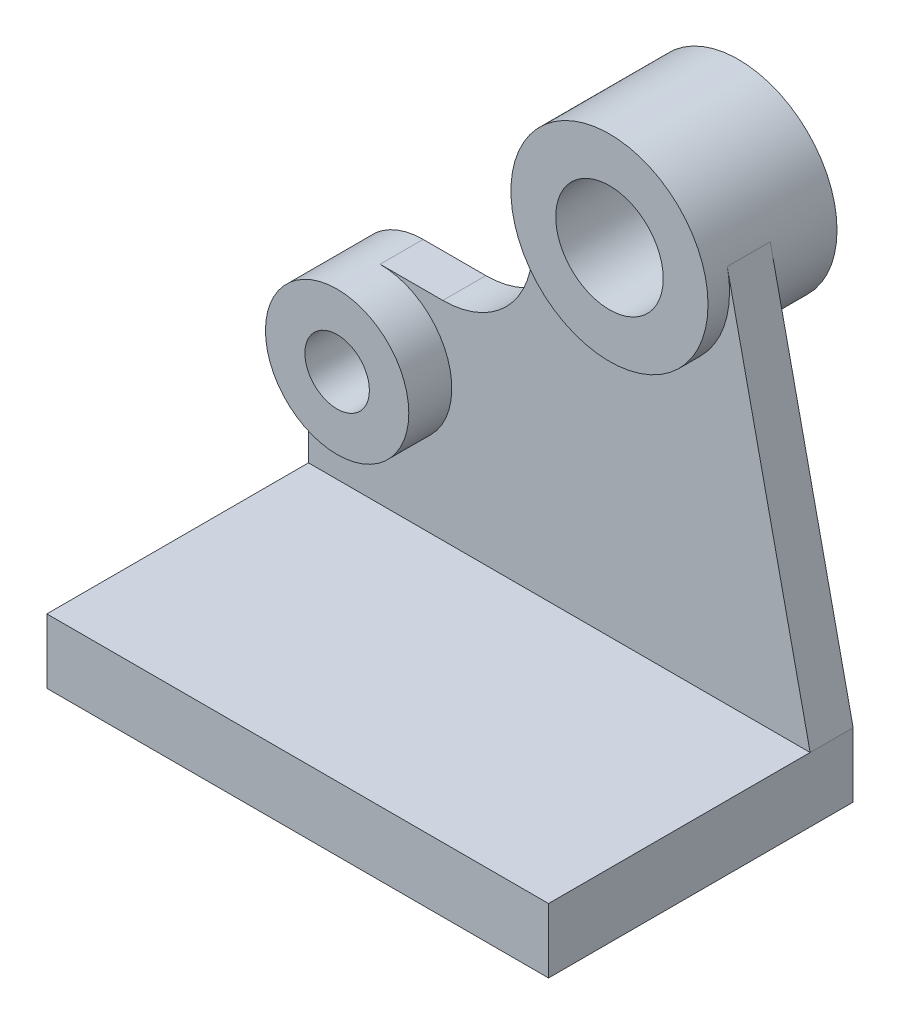
ISO-10303-21;
HEADER;
FILE_DESCRIPTION(('STEP AP214'),'2;1');
FILE_NAME('part.step','',(''),(''),'','','');
FILE_SCHEMA(('AUTOMOTIVE_DESIGN { 1 0 10303 214 1 1 1 1 }'));
ENDSEC;
DATA;
#1=APPLICATION_CONTEXT('core data for automotive mechanical design processes');
#2=APPLICATION_PROTOCOL_DEFINITION('international standard','automotive_design',2000,#1);
#3=PRODUCT_CONTEXT('',#1,'mechanical');
#4=PRODUCT('Part','Part','',(#3));
#5=PRODUCT_RELATED_PRODUCT_CATEGORY('part','',(#4));
#6=PRODUCT_DEFINITION_FORMATION('','',#4);
#7=PRODUCT_DEFINITION_CONTEXT('part definition',#1,'design');
#8=PRODUCT_DEFINITION('design','',#6,#7);
#9=PRODUCT_DEFINITION_SHAPE('','',#8);
#10=(LENGTH_UNIT() NAMED_UNIT(*) SI_UNIT(.MILLI.,.METRE.));
#11=(NAMED_UNIT(*) PLANE_ANGLE_UNIT() SI_UNIT($,.RADIAN.));
#12=(NAMED_UNIT(*) SI_UNIT($,.STERADIAN.) SOLID_ANGLE_UNIT());
#13=UNCERTAINTY_MEASURE_WITH_UNIT(LENGTH_MEASURE(1.E-05),#10,'distance_accuracy_value','');
#14=(GEOMETRIC_REPRESENTATION_CONTEXT(3) GLOBAL_UNCERTAINTY_ASSIGNED_CONTEXT((#13)) GLOBAL_UNIT_ASSIGNED_CONTEXT((#10,
#11,#12)) REPRESENTATION_CONTEXT('',''));
#15=CARTESIAN_POINT('',(0.,0.,0.));
#16=DIRECTION('',(0.,0.,1.));
#17=DIRECTION('',(1.,0.,0.));
#18=AXIS2_PLACEMENT_3D('',#15,#16,#17);
#19=CARTESIAN_POINT('',(-90.,0.,12.));
#20=DIRECTION('',(-1.,0.,0.));
#21=DIRECTION('',(0.,0.,1.));
#22=AXIS2_PLACEMENT_3D('',#19,#20,#21);
#23=PLANE('',#22);
#24=DIRECTION('',(0.,1.,0.));
#25=VECTOR('',#24,1.);
#26=CARTESIAN_POINT('',(-90.,0.,0.));
#27=LINE('',#26,#25);
#28=CARTESIAN_POINT('',(-90.,-118.,0.));
#29=VERTEX_POINT('',#28);
#30=CARTESIAN_POINT('',(-90.,-62.,0.));
#31=VERTEX_POINT('',#30);
#32=EDGE_CURVE('E199',#29,#31,#27,.T.);
#33=ORIENTED_EDGE('',*,*,#32,.F.);
#34=DIRECTION('',(0.,0.,-1.));
#35=VECTOR('',#34,1.);
#36=CARTESIAN_POINT('',(-90.,-118.,85.));
#37=LINE('',#36,#35);
#38=CARTESIAN_POINT('',(-90.,-118.,85.));
#39=VERTEX_POINT('',#38);
#40=EDGE_CURVE('E137',#39,#29,#37,.T.);
#41=ORIENTED_EDGE('',*,*,#40,.F.);
#42=DIRECTION('',(0.,1.,0.));
#43=VECTOR('',#42,1.);
#44=CARTESIAN_POINT('',(-90.,0.,85.));
#45=LINE('',#44,#43);
#46=CARTESIAN_POINT('',(-90.,-100.,85.));
#47=VERTEX_POINT('',#46);
#48=EDGE_CURVE('E143',#39,#47,#45,.T.);
#49=ORIENTED_EDGE('',*,*,#48,.T.);
#50=DIRECTION('',(0.,0.,-1.));
#51=VECTOR('',#50,1.);
#52=CARTESIAN_POINT('',(-90.,-100.,85.));
#53=LINE('',#52,#51);
#54=CARTESIAN_POINT('',(-90.,-100.,12.));
#55=VERTEX_POINT('',#54);
#56=EDGE_CURVE('E124',#47,#55,#53,.T.);
#57=ORIENTED_EDGE('',*,*,#56,.T.);
#58=DIRECTION('',(0.,1.,0.));
#59=VECTOR('',#58,1.);
#60=CARTESIAN_POINT('',(-90.,0.,12.));
#61=LINE('',#60,#59);
#62=CARTESIAN_POINT('',(-90.,-62.,12.));
#63=VERTEX_POINT('',#62);
#64=EDGE_CURVE('E208',#55,#63,#61,.T.);
#65=ORIENTED_EDGE('',*,*,#64,.T.);
#66=DIRECTION('',(0.,0.,-1.));
#67=VECTOR('',#66,1.);
#68=CARTESIAN_POINT('',(-90.,-62.,12.));
#69=LINE('',#68,#67);
#70=EDGE_CURVE('E259',#63,#31,#69,.T.);
#71=ORIENTED_EDGE('',*,*,#70,.T.);
#72=EDGE_LOOP('',(#33,#41,#49,#57,#65,#71));
#73=FACE_BOUND('',#72,.T.);
#74=ADVANCED_FACE('F45',(#73),#23,.T.);
#75=CARTESIAN_POINT('',(26.8660884818626,5.87054424093129,12.));
#76=DIRECTION('',(-0.97694867206773,-0.213474336033865,0.));
#77=DIRECTION('',(0.213474336033865,-0.97694867206773,0.));
#78=AXIS2_PLACEMENT_3D('',#75,#76,#77);
#79=PLANE('',#78);
#80=DIRECTION('',(-0.213474336033865,0.97694867206773,0.));
#81=VECTOR('',#80,1.);
#82=CARTESIAN_POINT('',(26.8660884818626,5.87054424093129,0.));
#83=LINE('',#82,#81);
#84=CARTESIAN_POINT('',(50.,-100.,0.));
#85=VERTEX_POINT('',#84);
#86=CARTESIAN_POINT('',(26.8660884818626,5.87054424093129,0.));
#87=VERTEX_POINT('',#86);
#88=EDGE_CURVE('E232',#85,#87,#83,.T.);
#89=ORIENTED_EDGE('',*,*,#88,.T.);
#90=DIRECTION('',(0.,0.,-1.));
#91=VECTOR('',#90,1.);
#92=CARTESIAN_POINT('',(26.8660884818626,5.87054424093129,12.));
#93=LINE('',#92,#91);
#94=CARTESIAN_POINT('',(26.8660884818626,5.87054424093129,12.));
#95=VERTEX_POINT('',#94);
#96=EDGE_CURVE('E252',#95,#87,#93,.T.);
#97=ORIENTED_EDGE('',*,*,#96,.F.);
#98=DIRECTION('',(-0.213474336033865,0.97694867206773,0.));
#99=VECTOR('',#98,1.);
#100=CARTESIAN_POINT('',(26.8660884818626,5.87054424093129,12.));
#101=LINE('',#100,#99);
#102=CARTESIAN_POINT('',(50.,-100.,12.));
#103=VERTEX_POINT('',#102);
#104=EDGE_CURVE('E214',#103,#95,#101,.T.);
#105=ORIENTED_EDGE('',*,*,#104,.F.);
#106=DIRECTION('',(0.,0.,-1.));
#107=VECTOR('',#106,1.);
#108=CARTESIAN_POINT('',(50.,-100.,12.));
#109=LINE('',#108,#107);
#110=EDGE_CURVE('E255',#103,#85,#109,.T.);
#111=ORIENTED_EDGE('',*,*,#110,.T.);
#112=EDGE_LOOP('',(#89,#97,#105,#111));
#113=FACE_BOUND('',#112,.T.);
#114=ADVANCED_FACE('F292',(#113),#79,.F.);
#115=CARTESIAN_POINT('',(-27.5,0.,12.));
#116=DIRECTION('',(-1.,0.,0.));
#117=DIRECTION('',(0.,-1.,0.));
#118=AXIS2_PLACEMENT_3D('',#115,#116,#117);
#119=PLANE('',#118);
#120=DIRECTION('',(0.,1.,0.));
#121=VECTOR('',#120,1.);
#122=CARTESIAN_POINT('',(-27.5,0.,0.));
#123=LINE('',#122,#121);
#124=CARTESIAN_POINT('',(-27.5,-17.,0.));
#125=VERTEX_POINT('',#124);
#126=CARTESIAN_POINT('',(-27.5,0.,0.));
#127=VERTEX_POINT('',#126);
#128=EDGE_CURVE('E240',#125,#127,#123,.T.);
#129=ORIENTED_EDGE('',*,*,#128,.F.);
#130=DIRECTION('',(0.,0.,-1.));
#131=VECTOR('',#130,1.);
#132=CARTESIAN_POINT('',(-27.5,-17.,12.));
#133=LINE('',#132,#131);
#134=CARTESIAN_POINT('',(-27.5,-17.,12.));
#135=VERTEX_POINT('',#134);
#136=EDGE_CURVE('E61',#125,#135,#133,.F.);
#137=ORIENTED_EDGE('',*,*,#136,.T.);
#138=DIRECTION('',(0.,1.,0.));
#139=VECTOR('',#138,1.);
#140=CARTESIAN_POINT('',(-27.5,0.,12.));
#141=LINE('',#140,#139);
#142=CARTESIAN_POINT('',(-27.5,0.,12.));
#143=VERTEX_POINT('',#142);
#144=EDGE_CURVE('E221',#135,#143,#141,.T.);
#145=ORIENTED_EDGE('',*,*,#144,.T.);
#146=DIRECTION('',(0.,0.,-1.));
#147=VECTOR('',#146,1.);
#148=CARTESIAN_POINT('',(-27.5,0.,12.));
#149=LINE('',#148,#147);
#150=EDGE_CURVE('E248',#143,#127,#149,.T.);
#151=ORIENTED_EDGE('',*,*,#150,.T.);
#152=EDGE_LOOP('',(#129,#137,#145,#151));
#153=FACE_BOUND('',#152,.T.);
#154=ADVANCED_FACE('F296',(#153),#119,.T.);
#155=CARTESIAN_POINT('',(0.,-42.,12.));
#156=DIRECTION('',(0.,1.,0.));
#157=DIRECTION('',(-1.,0.,0.));
#158=AXIS2_PLACEMENT_3D('',#155,#156,#157);
#159=PLANE('',#158);
#160=DIRECTION('',(1.,0.,0.));
#161=VECTOR('',#160,1.);
#162=CARTESIAN_POINT('',(0.,-42.,12.));
#163=LINE('',#162,#161);
#164=CARTESIAN_POINT('',(-70.,-42.,12.));
#165=VERTEX_POINT('',#164);
#166=CARTESIAN_POINT('',(-52.5,-42.,12.));
#167=VERTEX_POINT('',#166);
#168=EDGE_CURVE('E224',#165,#167,#163,.T.);
#169=ORIENTED_EDGE('',*,*,#168,.T.);
#170=DIRECTION('',(0.,0.,-1.));
#171=VECTOR('',#170,1.);
#172=CARTESIAN_POINT('',(-52.5,-42.,0.));
#173=LINE('',#172,#171);
#174=CARTESIAN_POINT('',(-52.5,-42.,0.));
#175=VERTEX_POINT('',#174);
#176=EDGE_CURVE('E263',#167,#175,#173,.T.);
#177=ORIENTED_EDGE('',*,*,#176,.T.);
#178=DIRECTION('',(1.,0.,0.));
#179=VECTOR('',#178,1.);
#180=CARTESIAN_POINT('',(0.,-42.,0.));
#181=LINE('',#180,#179);
#182=CARTESIAN_POINT('',(-70.,-42.,0.));
#183=VERTEX_POINT('',#182);
#184=EDGE_CURVE('E209',#183,#175,#181,.T.);
#185=ORIENTED_EDGE('',*,*,#184,.F.);
#186=DIRECTION('',(0.,0.,-1.));
#187=VECTOR('',#186,1.);
#188=CARTESIAN_POINT('',(-70.,-42.,12.));
#189=LINE('',#188,#187);
#190=EDGE_CURVE('E228',#165,#183,#189,.T.);
#191=ORIENTED_EDGE('',*,*,#190,.F.);
#192=EDGE_LOOP('',(#169,#177,#185,#191));
#193=FACE_BOUND('',#192,.T.);
#194=ADVANCED_FACE('F272',(#193),#159,.T.);
#195=CARTESIAN_POINT('',(0.,0.,12.));
#196=DIRECTION('',(0.,0.,1.));
#197=DIRECTION('',(1.,0.,0.));
#198=AXIS2_PLACEMENT_3D('',#195,#196,#197);
#199=PLANE('',#198);
#200=CARTESIAN_POINT('',(-70.,-62.,12.));
#201=DIRECTION('',(0.,0.,1.));
#202=DIRECTION('',(1.,0.,0.));
#203=AXIS2_PLACEMENT_3D('',#200,#201,#202);
#204=CIRCLE('',#203,20.);
#205=EDGE_CURVE('E205',#63,#165,#204,.T.);
#206=ORIENTED_EDGE('',*,*,#205,.F.);
#207=ORIENTED_EDGE('',*,*,#64,.F.);
#208=DIRECTION('',(1.,0.,0.));
#209=VECTOR('',#208,1.);
#210=CARTESIAN_POINT('',(0.,-100.,12.));
#211=LINE('',#210,#209);
#212=EDGE_CURVE('E130',#55,#103,#211,.T.);
#213=ORIENTED_EDGE('',*,*,#212,.T.);
#214=ORIENTED_EDGE('',*,*,#104,.T.);
#215=CARTESIAN_POINT('',(0.,0.,12.));
#216=DIRECTION('',(0.,0.,1.));
#217=DIRECTION('',(1.,0.,0.));
#218=AXIS2_PLACEMENT_3D('',#215,#216,#217);
#219=CIRCLE('',#218,27.5);
#220=EDGE_CURVE('E218',#143,#95,#219,.T.);
#221=ORIENTED_EDGE('',*,*,#220,.F.);
#222=ORIENTED_EDGE('',*,*,#144,.F.);
#223=CARTESIAN_POINT('',(-52.5,-17.,12.));
#224=DIRECTION('',(0.,0.,1.));
#225=DIRECTION('',(1.,0.,0.));
#226=AXIS2_PLACEMENT_3D('',#223,#224,#225);
#227=CIRCLE('',#226,25.);
#228=EDGE_CURVE('E11',#135,#167,#227,.F.);
#229=ORIENTED_EDGE('',*,*,#228,.T.);
#230=ORIENTED_EDGE('',*,*,#168,.F.);
#231=EDGE_LOOP('',(#206,#207,#213,#214,#221,#222,#229,#230));
#232=FACE_BOUND('',#231,.T.);
#233=ADVANCED_FACE('F283',(#232),#199,.T.);
#234=CARTESIAN_POINT('',(0.,0.,0.));
#235=DIRECTION('',(0.,0.,1.));
#236=DIRECTION('',(1.,0.,0.));
#237=AXIS2_PLACEMENT_3D('',#234,#235,#236);
#238=PLANE('',#237);
#239=ORIENTED_EDGE('',*,*,#32,.T.);
#240=CARTESIAN_POINT('',(-70.,-62.,0.));
#241=DIRECTION('',(0.,0.,1.));
#242=DIRECTION('',(1.,0.,0.));
#243=AXIS2_PLACEMENT_3D('',#240,#241,#242);
#244=CIRCLE('',#243,20.);
#245=EDGE_CURVE('E195',#183,#31,#244,.T.);
#246=ORIENTED_EDGE('',*,*,#245,.F.);
#247=ORIENTED_EDGE('',*,*,#184,.T.);
#248=CARTESIAN_POINT('',(-52.5,-17.,0.));
#249=DIRECTION('',(0.,0.,1.));
#250=DIRECTION('',(1.,0.,0.));
#251=AXIS2_PLACEMENT_3D('',#248,#249,#250);
#252=CIRCLE('',#251,25.);
#253=EDGE_CURVE('E54',#175,#125,#252,.T.);
#254=ORIENTED_EDGE('',*,*,#253,.T.);
#255=ORIENTED_EDGE('',*,*,#128,.T.);
#256=CARTESIAN_POINT('',(0.,0.,0.));
#257=DIRECTION('',(0.,0.,1.));
#258=DIRECTION('',(1.,0.,0.));
#259=AXIS2_PLACEMENT_3D('',#256,#257,#258);
#260=CIRCLE('',#259,27.5);
#261=EDGE_CURVE('E236',#127,#87,#260,.T.);
#262=ORIENTED_EDGE('',*,*,#261,.T.);
#263=ORIENTED_EDGE('',*,*,#88,.F.);
#264=DIRECTION('',(0.,-1.,0.));
#265=VECTOR('',#264,1.);
#266=CARTESIAN_POINT('',(50.,0.,0.));
#267=LINE('',#266,#265);
#268=CARTESIAN_POINT('',(50.,-118.,0.));
#269=VERTEX_POINT('',#268);
#270=EDGE_CURVE('E148',#85,#269,#267,.T.);
#271=ORIENTED_EDGE('',*,*,#270,.T.);
#272=DIRECTION('',(-1.,0.,0.));
#273=VECTOR('',#272,1.);
#274=CARTESIAN_POINT('',(0.,-118.,0.));
#275=LINE('',#274,#273);
#276=EDGE_CURVE('E160',#269,#29,#275,.T.);
#277=ORIENTED_EDGE('',*,*,#276,.T.);
#278=EDGE_LOOP('',(#239,#246,#247,#254,#255,#262,#263,#271,#277));
#279=FACE_BOUND('',#278,.T.);
#280=CARTESIAN_POINT('',(-70.,-62.,0.));
#281=DIRECTION('',(0.,0.,1.));
#282=DIRECTION('',(1.,0.,0.));
#283=AXIS2_PLACEMENT_3D('',#280,#281,#282);
#284=CIRCLE('',#283,9.);
#285=CARTESIAN_POINT('',(-61.,-62.,0.));
#286=VERTEX_POINT('',#285);
#287=EDGE_CURVE('E183',#286,#286,#284,.T.);
#288=ORIENTED_EDGE('',*,*,#287,.T.);
#289=EDGE_LOOP('',(#288));
#290=FACE_BOUND('',#289,.T.);
#291=ADVANCED_FACE('F277',(#279,#290),#238,.F.);
#292=CARTESIAN_POINT('',(-70.,-62.,24.));
#293=DIRECTION('',(0.,0.,-1.));
#294=DIRECTION('',(-1.,0.,0.));
#295=AXIS2_PLACEMENT_3D('',#292,#293,#294);
#296=CYLINDRICAL_SURFACE('',#295,20.);
#297=CARTESIAN_POINT('',(-70.,-62.,24.));
#298=DIRECTION('',(0.,0.,1.));
#299=DIRECTION('',(1.,0.,0.));
#300=AXIS2_PLACEMENT_3D('',#297,#298,#299);
#301=CIRCLE('',#300,20.);
#302=CARTESIAN_POINT('',(-50.,-62.,24.));
#303=VERTEX_POINT('',#302);
#304=EDGE_CURVE('E194',#303,#303,#301,.T.);
#305=ORIENTED_EDGE('',*,*,#304,.F.);
#306=EDGE_LOOP('',(#305));
#307=FACE_BOUND('',#306,.T.);
#308=ORIENTED_EDGE('',*,*,#245,.T.);
#309=ORIENTED_EDGE('',*,*,#70,.F.);
#310=ORIENTED_EDGE('',*,*,#205,.T.);
#311=ORIENTED_EDGE('',*,*,#190,.T.);
#312=EDGE_LOOP('',(#308,#309,#310,#311));
#313=FACE_BOUND('',#312,.T.);
#314=ADVANCED_FACE('F280',(#307,#313),#296,.T.);
#315=CARTESIAN_POINT('',(-70.,-62.,24.));
#316=DIRECTION('',(0.,0.,-1.));
#317=DIRECTION('',(-1.,0.,0.));
#318=AXIS2_PLACEMENT_3D('',#315,#316,#317);
#319=CYLINDRICAL_SURFACE('',#318,9.);
#320=CARTESIAN_POINT('',(-70.,-62.,24.));
#321=DIRECTION('',(0.,0.,1.));
#322=DIRECTION('',(1.,0.,0.));
#323=AXIS2_PLACEMENT_3D('',#320,#321,#322);
#324=CIRCLE('',#323,9.);
#325=CARTESIAN_POINT('',(-61.,-62.,24.));
#326=VERTEX_POINT('',#325);
#327=EDGE_CURVE('E190',#326,#326,#324,.T.);
#328=ORIENTED_EDGE('',*,*,#327,.T.);
#329=EDGE_LOOP('',(#328));
#330=FACE_BOUND('',#329,.T.);
#331=ORIENTED_EDGE('',*,*,#287,.F.);
#332=EDGE_LOOP('',(#331));
#333=FACE_BOUND('',#332,.T.);
#334=ADVANCED_FACE('F308',(#330,#333),#319,.F.);
#335=CARTESIAN_POINT('',(0.,0.,24.));
#336=DIRECTION('',(0.,0.,1.));
#337=DIRECTION('',(1.,0.,0.));
#338=AXIS2_PLACEMENT_3D('',#335,#336,#337);
#339=PLANE('',#338);
#340=ORIENTED_EDGE('',*,*,#327,.F.);
#341=EDGE_LOOP('',(#340));
#342=FACE_BOUND('',#341,.T.);
#343=ORIENTED_EDGE('',*,*,#304,.T.);
#344=EDGE_LOOP('',(#343));
#345=FACE_BOUND('',#344,.T.);
#346=ADVANCED_FACE('F311',(#342,#345),#339,.T.);
#347=CARTESIAN_POINT('',(0.,0.,18.));
#348=DIRECTION('',(0.,0.,-1.));
#349=DIRECTION('',(-1.,0.,0.));
#350=AXIS2_PLACEMENT_3D('',#347,#348,#349);
#351=CYLINDRICAL_SURFACE('',#350,15.);
#352=CARTESIAN_POINT('',(0.,0.,18.));
#353=DIRECTION('',(0.,0.,1.));
#354=DIRECTION('',(1.,0.,0.));
#355=AXIS2_PLACEMENT_3D('',#352,#353,#354);
#356=CIRCLE('',#355,15.);
#357=CARTESIAN_POINT('',(15.,0.,18.));
#358=VERTEX_POINT('',#357);
#359=EDGE_CURVE('E174',#358,#358,#356,.T.);
#360=ORIENTED_EDGE('',*,*,#359,.T.);
#361=EDGE_LOOP('',(#360));
#362=FACE_BOUND('',#361,.T.);
#363=CARTESIAN_POINT('',(0.,0.,-18.));
#364=DIRECTION('',(0.,0.,1.));
#365=DIRECTION('',(1.,0.,0.));
#366=AXIS2_PLACEMENT_3D('',#363,#364,#365);
#367=CIRCLE('',#366,15.);
#368=CARTESIAN_POINT('',(15.,0.,-18.));
#369=VERTEX_POINT('',#368);
#370=EDGE_CURVE('E136',#369,#369,#367,.T.);
#371=ORIENTED_EDGE('',*,*,#370,.F.);
#372=EDGE_LOOP('',(#371));
#373=FACE_BOUND('',#372,.T.);
#374=ADVANCED_FACE('F318',(#362,#373),#351,.F.);
#375=CARTESIAN_POINT('',(0.,0.,18.));
#376=DIRECTION('',(0.,0.,-1.));
#377=DIRECTION('',(-1.,0.,0.));
#378=AXIS2_PLACEMENT_3D('',#375,#376,#377);
#379=CYLINDRICAL_SURFACE('',#378,27.5);
#380=ORIENTED_EDGE('',*,*,#220,.T.);
#381=ORIENTED_EDGE('',*,*,#96,.T.);
#382=ORIENTED_EDGE('',*,*,#261,.F.);
#383=ORIENTED_EDGE('',*,*,#150,.F.);
#384=EDGE_LOOP('',(#380,#381,#382,#383));
#385=FACE_BOUND('',#384,.T.);
#386=CARTESIAN_POINT('',(0.,0.,18.));
#387=DIRECTION('',(0.,0.,1.));
#388=DIRECTION('',(1.,0.,0.));
#389=AXIS2_PLACEMENT_3D('',#386,#387,#388);
#390=CIRCLE('',#389,27.5);
#391=CARTESIAN_POINT('',(27.5,0.,18.));
#392=VERTEX_POINT('',#391);
#393=EDGE_CURVE('E178',#392,#392,#390,.T.);
#394=ORIENTED_EDGE('',*,*,#393,.F.);
#395=EDGE_LOOP('',(#394));
#396=FACE_BOUND('',#395,.T.);
#397=CARTESIAN_POINT('',(0.,0.,-18.));
#398=DIRECTION('',(0.,0.,1.));
#399=DIRECTION('',(1.,0.,0.));
#400=AXIS2_PLACEMENT_3D('',#397,#398,#399);
#401=CIRCLE('',#400,27.5);
#402=CARTESIAN_POINT('',(27.5,0.,-18.));
#403=VERTEX_POINT('',#402);
#404=EDGE_CURVE('E179',#403,#403,#401,.T.);
#405=ORIENTED_EDGE('',*,*,#404,.T.);
#406=EDGE_LOOP('',(#405));
#407=FACE_BOUND('',#406,.T.);
#408=ADVANCED_FACE('F322',(#385,#396,#407),#379,.T.);
#409=CARTESIAN_POINT('',(0.,0.,18.));
#410=DIRECTION('',(0.,0.,1.));
#411=DIRECTION('',(1.,0.,0.));
#412=AXIS2_PLACEMENT_3D('',#409,#410,#411);
#413=PLANE('',#412);
#414=ORIENTED_EDGE('',*,*,#359,.F.);
#415=EDGE_LOOP('',(#414));
#416=FACE_BOUND('',#415,.T.);
#417=ORIENTED_EDGE('',*,*,#393,.T.);
#418=EDGE_LOOP('',(#417));
#419=FACE_BOUND('',#418,.T.);
#420=ADVANCED_FACE('F326',(#416,#419),#413,.T.);
#421=CARTESIAN_POINT('',(0.,0.,-18.));
#422=DIRECTION('',(0.,0.,1.));
#423=DIRECTION('',(1.,0.,0.));
#424=AXIS2_PLACEMENT_3D('',#421,#422,#423);
#425=PLANE('',#424);
#426=ORIENTED_EDGE('',*,*,#370,.T.);
#427=EDGE_LOOP('',(#426));
#428=FACE_BOUND('',#427,.T.);
#429=ORIENTED_EDGE('',*,*,#404,.F.);
#430=EDGE_LOOP('',(#429));
#431=FACE_BOUND('',#430,.T.);
#432=ADVANCED_FACE('F328',(#428,#431),#425,.F.);
#433=CARTESIAN_POINT('',(0.,-100.,85.));
#434=DIRECTION('',(0.,1.,0.));
#435=DIRECTION('',(0.,0.,1.));
#436=AXIS2_PLACEMENT_3D('',#433,#434,#435);
#437=PLANE('',#436);
#438=ORIENTED_EDGE('',*,*,#212,.F.);
#439=ORIENTED_EDGE('',*,*,#56,.F.);
#440=DIRECTION('',(1.,0.,0.));
#441=VECTOR('',#440,1.);
#442=CARTESIAN_POINT('',(0.,-100.,85.));
#443=LINE('',#442,#441);
#444=CARTESIAN_POINT('',(50.,-100.,85.));
#445=VERTEX_POINT('',#444);
#446=EDGE_CURVE('E127',#47,#445,#443,.T.);
#447=ORIENTED_EDGE('',*,*,#446,.T.);
#448=DIRECTION('',(0.,0.,-1.));
#449=VECTOR('',#448,1.);
#450=CARTESIAN_POINT('',(50.,-100.,85.));
#451=LINE('',#450,#449);
#452=EDGE_CURVE('E159',#445,#103,#451,.T.);
#453=ORIENTED_EDGE('',*,*,#452,.T.);
#454=EDGE_LOOP('',(#438,#439,#447,#453));
#455=FACE_BOUND('',#454,.T.);
#456=ADVANCED_FACE('F126',(#455),#437,.T.);
#457=CARTESIAN_POINT('',(0.,-118.,85.));
#458=DIRECTION('',(0.,-1.,0.));
#459=DIRECTION('',(1.,0.,0.));
#460=AXIS2_PLACEMENT_3D('',#457,#458,#459);
#461=PLANE('',#460);
#462=ORIENTED_EDGE('',*,*,#276,.F.);
#463=DIRECTION('',(0.,0.,-1.));
#464=VECTOR('',#463,1.);
#465=CARTESIAN_POINT('',(50.,-118.,85.));
#466=LINE('',#465,#464);
#467=CARTESIAN_POINT('',(50.,-118.,85.));
#468=VERTEX_POINT('',#467);
#469=EDGE_CURVE('E169',#468,#269,#466,.T.);
#470=ORIENTED_EDGE('',*,*,#469,.F.);
#471=DIRECTION('',(-1.,0.,0.));
#472=VECTOR('',#471,1.);
#473=CARTESIAN_POINT('',(0.,-118.,85.));
#474=LINE('',#473,#472);
#475=EDGE_CURVE('E152',#468,#39,#474,.T.);
#476=ORIENTED_EDGE('',*,*,#475,.T.);
#477=ORIENTED_EDGE('',*,*,#40,.T.);
#478=EDGE_LOOP('',(#462,#470,#476,#477));
#479=FACE_BOUND('',#478,.T.);
#480=ADVANCED_FACE('F337',(#479),#461,.T.);
#481=CARTESIAN_POINT('',(50.,0.,85.));
#482=DIRECTION('',(1.,0.,0.));
#483=DIRECTION('',(0.,0.,-1.));
#484=AXIS2_PLACEMENT_3D('',#481,#482,#483);
#485=PLANE('',#484);
#486=ORIENTED_EDGE('',*,*,#270,.F.);
#487=ORIENTED_EDGE('',*,*,#110,.F.);
#488=ORIENTED_EDGE('',*,*,#452,.F.);
#489=DIRECTION('',(0.,-1.,0.));
#490=VECTOR('',#489,1.);
#491=CARTESIAN_POINT('',(50.,0.,85.));
#492=LINE('',#491,#490);
#493=EDGE_CURVE('E146',#445,#468,#492,.T.);
#494=ORIENTED_EDGE('',*,*,#493,.T.);
#495=ORIENTED_EDGE('',*,*,#469,.T.);
#496=EDGE_LOOP('',(#486,#487,#488,#494,#495));
#497=FACE_BOUND('',#496,.T.);
#498=ADVANCED_FACE('F289',(#497),#485,.T.);
#499=CARTESIAN_POINT('',(0.,0.,85.));
#500=DIRECTION('',(0.,0.,1.));
#501=DIRECTION('',(1.,0.,0.));
#502=AXIS2_PLACEMENT_3D('',#499,#500,#501);
#503=PLANE('',#502);
#504=ORIENTED_EDGE('',*,*,#446,.F.);
#505=ORIENTED_EDGE('',*,*,#48,.F.);
#506=ORIENTED_EDGE('',*,*,#475,.F.);
#507=ORIENTED_EDGE('',*,*,#493,.F.);
#508=EDGE_LOOP('',(#504,#505,#506,#507));
#509=FACE_BOUND('',#508,.T.);
#510=ADVANCED_FACE('F141',(#509),#503,.T.);
#511=CARTESIAN_POINT('',(-52.5,-17.,12.));
#512=DIRECTION('',(0.,0.,1.));
#513=DIRECTION('',(1.,0.,0.));
#514=AXIS2_PLACEMENT_3D('',#511,#512,#513);
#515=CYLINDRICAL_SURFACE('',#514,25.);
#516=ORIENTED_EDGE('',*,*,#228,.F.);
#517=ORIENTED_EDGE('',*,*,#136,.F.);
#518=ORIENTED_EDGE('',*,*,#253,.F.);
#519=ORIENTED_EDGE('',*,*,#176,.F.);
#520=EDGE_LOOP('',(#516,#517,#518,#519));
#521=FACE_BOUND('',#520,.T.);
#522=ADVANCED_FACE('F47',(#521),#515,.F.);
#523=CLOSED_SHELL('',(#74,#114,#154,#194,#233,#291,#314,#334,#346,#374,#408,#420,#432,#456,#480,
#498,#510,#522));
#524=MANIFOLD_SOLID_BREP('B2',#523);
#525=ADVANCED_BREP_SHAPE_REPRESENTATION('',(#18,#524),#14);
#526=SHAPE_DEFINITION_REPRESENTATION(#9,#525);
ENDSEC;
END-ISO-10303-21;
